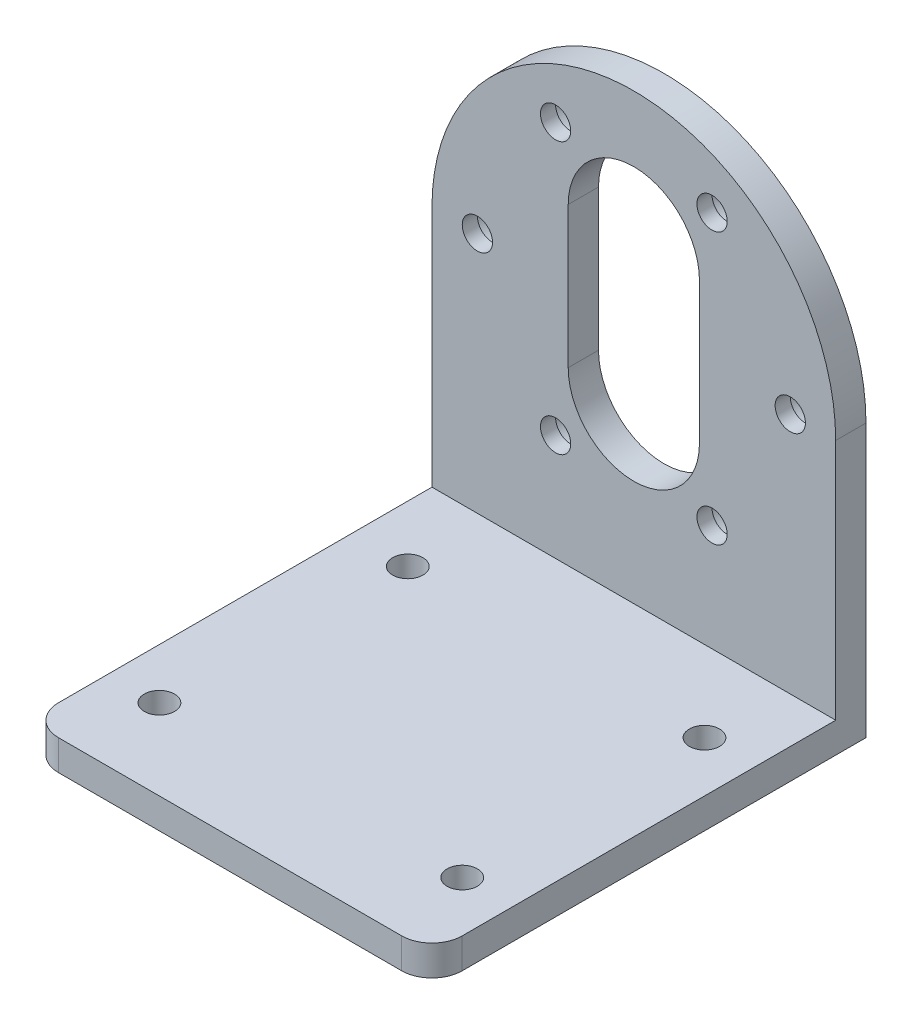
ISO-10303-21;
HEADER;
FILE_DESCRIPTION(('STEP AP214'),'2;1');
FILE_NAME('part.step','',(''),(''),'','','');
FILE_SCHEMA(('AUTOMOTIVE_DESIGN { 1 0 10303 214 1 1 1 1 }'));
ENDSEC;
DATA;
#1=APPLICATION_CONTEXT('core data for automotive mechanical design processes');
#2=APPLICATION_PROTOCOL_DEFINITION('international standard','automotive_design',2000,#1);
#3=PRODUCT_CONTEXT('',#1,'mechanical');
#4=PRODUCT('Part','Part','',(#3));
#5=PRODUCT_RELATED_PRODUCT_CATEGORY('part','',(#4));
#6=PRODUCT_DEFINITION_FORMATION('','',#4);
#7=PRODUCT_DEFINITION_CONTEXT('part definition',#1,'design');
#8=PRODUCT_DEFINITION('design','',#6,#7);
#9=PRODUCT_DEFINITION_SHAPE('','',#8);
#10=(LENGTH_UNIT() NAMED_UNIT(*) SI_UNIT(.MILLI.,.METRE.));
#11=(NAMED_UNIT(*) PLANE_ANGLE_UNIT() SI_UNIT($,.RADIAN.));
#12=(NAMED_UNIT(*) SI_UNIT($,.STERADIAN.) SOLID_ANGLE_UNIT());
#13=UNCERTAINTY_MEASURE_WITH_UNIT(LENGTH_MEASURE(1.E-05),#10,'distance_accuracy_value','');
#14=(GEOMETRIC_REPRESENTATION_CONTEXT(3) GLOBAL_UNCERTAINTY_ASSIGNED_CONTEXT((#13)) GLOBAL_UNIT_ASSIGNED_CONTEXT((#10,
#11,#12)) REPRESENTATION_CONTEXT('',''));
#15=CARTESIAN_POINT('',(0.,0.,0.));
#16=DIRECTION('',(0.,0.,1.));
#17=DIRECTION('',(1.,0.,0.));
#18=AXIS2_PLACEMENT_3D('',#15,#16,#17);
#19=CARTESIAN_POINT('',(-20.,27.,3.));
#20=DIRECTION('',(1.,0.,0.));
#21=DIRECTION('',(0.,0.,-1.));
#22=AXIS2_PLACEMENT_3D('',#19,#20,#21);
#23=PLANE('',#22);
#24=DIRECTION('',(0.,0.,-1.));
#25=VECTOR('',#24,1.);
#26=CARTESIAN_POINT('',(-20.,0.,3.));
#27=LINE('',#26,#25);
#28=CARTESIAN_POINT('',(-20.,0.,40.));
#29=VERTEX_POINT('',#28);
#30=CARTESIAN_POINT('',(-20.,0.,0.));
#31=VERTEX_POINT('',#30);
#32=EDGE_CURVE('E300',#29,#31,#27,.T.);
#33=ORIENTED_EDGE('',*,*,#32,.F.);
#34=DIRECTION('',(0.,-1.,0.));
#35=VECTOR('',#34,1.);
#36=CARTESIAN_POINT('',(-20.,27.,40.));
#37=LINE('',#36,#35);
#38=CARTESIAN_POINT('',(-20.,3.,40.));
#39=VERTEX_POINT('',#38);
#40=EDGE_CURVE('E11',#29,#39,#37,.F.);
#41=ORIENTED_EDGE('',*,*,#40,.T.);
#42=DIRECTION('',(0.,0.,-1.));
#43=VECTOR('',#42,1.);
#44=CARTESIAN_POINT('',(-20.,3.,43.));
#45=LINE('',#44,#43);
#46=CARTESIAN_POINT('',(-20.,3.,3.));
#47=VERTEX_POINT('',#46);
#48=EDGE_CURVE('E252',#39,#47,#45,.T.);
#49=ORIENTED_EDGE('',*,*,#48,.T.);
#50=DIRECTION('',(0.,-1.,0.));
#51=VECTOR('',#50,1.);
#52=CARTESIAN_POINT('',(-20.,27.,3.));
#53=LINE('',#52,#51);
#54=CARTESIAN_POINT('',(-20.,27.,3.));
#55=VERTEX_POINT('',#54);
#56=EDGE_CURVE('E406',#55,#47,#53,.T.);
#57=ORIENTED_EDGE('',*,*,#56,.F.);
#58=DIRECTION('',(0.,0.,-1.));
#59=VECTOR('',#58,1.);
#60=CARTESIAN_POINT('',(-20.,27.,3.));
#61=LINE('',#60,#59);
#62=CARTESIAN_POINT('',(-20.,27.,0.));
#63=VERTEX_POINT('',#62);
#64=EDGE_CURVE('E407',#55,#63,#61,.T.);
#65=ORIENTED_EDGE('',*,*,#64,.T.);
#66=DIRECTION('',(0.,-1.,0.));
#67=VECTOR('',#66,1.);
#68=CARTESIAN_POINT('',(-20.,27.,0.));
#69=LINE('',#68,#67);
#70=EDGE_CURVE('E274',#63,#31,#69,.T.);
#71=ORIENTED_EDGE('',*,*,#70,.T.);
#72=EDGE_LOOP('',(#33,#41,#49,#57,#65,#71));
#73=FACE_BOUND('',#72,.T.);
#74=ADVANCED_FACE('F35',(#73),#23,.F.);
#75=CARTESIAN_POINT('',(-20.,0.,3.));
#76=DIRECTION('',(0.,1.,0.));
#77=DIRECTION('',(0.,0.,1.));
#78=AXIS2_PLACEMENT_3D('',#75,#76,#77);
#79=PLANE('',#78);
#80=CARTESIAN_POINT('',(15.,0.,11.));
#81=DIRECTION('',(0.,-1.,0.));
#82=DIRECTION('',(0.,0.,-1.));
#83=AXIS2_PLACEMENT_3D('',#80,#81,#82);
#84=CIRCLE('',#83,1.5);
#85=CARTESIAN_POINT('',(15.,0.,9.5));
#86=VERTEX_POINT('',#85);
#87=EDGE_CURVE('E129',#86,#86,#84,.T.);
#88=ORIENTED_EDGE('',*,*,#87,.F.);
#89=EDGE_LOOP('',(#88));
#90=FACE_BOUND('',#89,.T.);
#91=CARTESIAN_POINT('',(-14.3941467899274,0.,11.));
#92=DIRECTION('',(0.,-1.,0.));
#93=DIRECTION('',(0.,0.,-1.));
#94=AXIS2_PLACEMENT_3D('',#91,#92,#93);
#95=CIRCLE('',#94,1.5);
#96=CARTESIAN_POINT('',(-14.3941467899274,0.,9.5));
#97=VERTEX_POINT('',#96);
#98=EDGE_CURVE('E161',#97,#97,#95,.T.);
#99=ORIENTED_EDGE('',*,*,#98,.F.);
#100=EDGE_LOOP('',(#99));
#101=FACE_BOUND('',#100,.T.);
#102=CARTESIAN_POINT('',(15.,0.,35.));
#103=DIRECTION('',(0.,-1.,0.));
#104=DIRECTION('',(0.,0.,-1.));
#105=AXIS2_PLACEMENT_3D('',#102,#103,#104);
#106=CIRCLE('',#105,1.5);
#107=CARTESIAN_POINT('',(15.,0.,33.5));
#108=VERTEX_POINT('',#107);
#109=EDGE_CURVE('E165',#108,#108,#106,.T.);
#110=ORIENTED_EDGE('',*,*,#109,.F.);
#111=EDGE_LOOP('',(#110));
#112=FACE_BOUND('',#111,.T.);
#113=CARTESIAN_POINT('',(-15.,0.,35.));
#114=DIRECTION('',(0.,-1.,0.));
#115=DIRECTION('',(0.,0.,-1.));
#116=AXIS2_PLACEMENT_3D('',#113,#114,#115);
#117=CIRCLE('',#116,1.5);
#118=CARTESIAN_POINT('',(-15.,0.,33.5));
#119=VERTEX_POINT('',#118);
#120=EDGE_CURVE('E169',#119,#119,#117,.T.);
#121=ORIENTED_EDGE('',*,*,#120,.F.);
#122=EDGE_LOOP('',(#121));
#123=FACE_BOUND('',#122,.T.);
#124=DIRECTION('',(0.,0.,-1.));
#125=VECTOR('',#124,1.);
#126=CARTESIAN_POINT('',(20.,0.,3.));
#127=LINE('',#126,#125);
#128=CARTESIAN_POINT('',(20.,0.,40.));
#129=VERTEX_POINT('',#128);
#130=CARTESIAN_POINT('',(20.,0.,0.));
#131=VERTEX_POINT('',#130);
#132=EDGE_CURVE('E288',#129,#131,#127,.T.);
#133=ORIENTED_EDGE('',*,*,#132,.F.);
#134=CARTESIAN_POINT('',(17.,0.,40.));
#135=DIRECTION('',(0.,1.,0.));
#136=DIRECTION('',(0.,0.,1.));
#137=AXIS2_PLACEMENT_3D('',#134,#135,#136);
#138=CIRCLE('',#137,3.);
#139=CARTESIAN_POINT('',(17.,0.,43.));
#140=VERTEX_POINT('',#139);
#141=EDGE_CURVE('E43',#129,#140,#138,.F.);
#142=ORIENTED_EDGE('',*,*,#141,.T.);
#143=DIRECTION('',(1.,0.,0.));
#144=VECTOR('',#143,1.);
#145=CARTESIAN_POINT('',(-20.,0.,43.));
#146=LINE('',#145,#144);
#147=CARTESIAN_POINT('',(-17.,0.,43.));
#148=VERTEX_POINT('',#147);
#149=EDGE_CURVE('E246',#148,#140,#146,.T.);
#150=ORIENTED_EDGE('',*,*,#149,.F.);
#151=CARTESIAN_POINT('',(-17.,0.,40.));
#152=DIRECTION('',(0.,1.,0.));
#153=DIRECTION('',(0.,0.,1.));
#154=AXIS2_PLACEMENT_3D('',#151,#152,#153);
#155=CIRCLE('',#154,3.);
#156=EDGE_CURVE('E281',#148,#29,#155,.F.);
#157=ORIENTED_EDGE('',*,*,#156,.T.);
#158=ORIENTED_EDGE('',*,*,#32,.T.);
#159=DIRECTION('',(1.,0.,0.));
#160=VECTOR('',#159,1.);
#161=CARTESIAN_POINT('',(-20.,0.,0.));
#162=LINE('',#161,#160);
#163=EDGE_CURVE('E396',#31,#131,#162,.T.);
#164=ORIENTED_EDGE('',*,*,#163,.T.);
#165=EDGE_LOOP('',(#133,#142,#150,#157,#158,#164));
#166=FACE_BOUND('',#165,.T.);
#167=ADVANCED_FACE('F286',(#90,#101,#112,#123,#166),#79,.F.);
#168=CARTESIAN_POINT('',(20.,27.,3.));
#169=DIRECTION('',(-1.,0.,0.));
#170=DIRECTION('',(0.,0.,1.));
#171=AXIS2_PLACEMENT_3D('',#168,#169,#170);
#172=PLANE('',#171);
#173=DIRECTION('',(0.,0.,-1.));
#174=VECTOR('',#173,1.);
#175=CARTESIAN_POINT('',(20.,3.,43.));
#176=LINE('',#175,#174);
#177=CARTESIAN_POINT('',(20.,3.,40.));
#178=VERTEX_POINT('',#177);
#179=CARTESIAN_POINT('',(20.,3.,3.));
#180=VERTEX_POINT('',#179);
#181=EDGE_CURVE('E270',#178,#180,#176,.T.);
#182=ORIENTED_EDGE('',*,*,#181,.F.);
#183=DIRECTION('',(0.,1.,0.));
#184=VECTOR('',#183,1.);
#185=CARTESIAN_POINT('',(20.,27.,40.));
#186=LINE('',#185,#184);
#187=EDGE_CURVE('E279',#178,#129,#186,.F.);
#188=ORIENTED_EDGE('',*,*,#187,.T.);
#189=ORIENTED_EDGE('',*,*,#132,.T.);
#190=DIRECTION('',(0.,1.,0.));
#191=VECTOR('',#190,1.);
#192=CARTESIAN_POINT('',(20.,27.,0.));
#193=LINE('',#192,#191);
#194=CARTESIAN_POINT('',(20.,27.,0.));
#195=VERTEX_POINT('',#194);
#196=EDGE_CURVE('E399',#131,#195,#193,.T.);
#197=ORIENTED_EDGE('',*,*,#196,.T.);
#198=DIRECTION('',(0.,0.,-1.));
#199=VECTOR('',#198,1.);
#200=CARTESIAN_POINT('',(20.,27.,3.));
#201=LINE('',#200,#199);
#202=CARTESIAN_POINT('',(20.,27.,3.));
#203=VERTEX_POINT('',#202);
#204=EDGE_CURVE('E409',#203,#195,#201,.T.);
#205=ORIENTED_EDGE('',*,*,#204,.F.);
#206=DIRECTION('',(0.,1.,0.));
#207=VECTOR('',#206,1.);
#208=CARTESIAN_POINT('',(20.,27.,3.));
#209=LINE('',#208,#207);
#210=EDGE_CURVE('E261',#180,#203,#209,.T.);
#211=ORIENTED_EDGE('',*,*,#210,.F.);
#212=EDGE_LOOP('',(#182,#188,#189,#197,#205,#211));
#213=FACE_BOUND('',#212,.T.);
#214=ADVANCED_FACE('F336',(#213),#172,.F.);
#215=CARTESIAN_POINT('',(0.,27.,3.));
#216=DIRECTION('',(0.,0.,-1.));
#217=DIRECTION('',(-1.,0.,0.));
#218=AXIS2_PLACEMENT_3D('',#215,#216,#217);
#219=CYLINDRICAL_SURFACE('',#218,20.);
#220=CARTESIAN_POINT('',(0.,27.,0.));
#221=DIRECTION('',(0.,0.,1.));
#222=DIRECTION('',(1.,0.,0.));
#223=AXIS2_PLACEMENT_3D('',#220,#221,#222);
#224=CIRCLE('',#223,20.);
#225=EDGE_CURVE('E395',#195,#63,#224,.T.);
#226=ORIENTED_EDGE('',*,*,#225,.T.);
#227=ORIENTED_EDGE('',*,*,#64,.F.);
#228=CARTESIAN_POINT('',(0.,27.,3.));
#229=DIRECTION('',(0.,0.,1.));
#230=DIRECTION('',(1.,0.,0.));
#231=AXIS2_PLACEMENT_3D('',#228,#229,#230);
#232=CIRCLE('',#231,20.);
#233=EDGE_CURVE('E402',#203,#55,#232,.T.);
#234=ORIENTED_EDGE('',*,*,#233,.F.);
#235=ORIENTED_EDGE('',*,*,#204,.T.);
#236=EDGE_LOOP('',(#226,#227,#234,#235));
#237=FACE_BOUND('',#236,.T.);
#238=ADVANCED_FACE('F421',(#237),#219,.T.);
#239=CARTESIAN_POINT('',(0.,27.,3.));
#240=DIRECTION('',(0.,0.,1.));
#241=DIRECTION('',(1.,0.,0.));
#242=AXIS2_PLACEMENT_3D('',#239,#240,#241);
#243=PLANE('',#242);
#244=CARTESIAN_POINT('',(0.,34.,3.));
#245=DIRECTION('',(0.,0.,1.));
#246=DIRECTION('',(1.,0.,0.));
#247=AXIS2_PLACEMENT_3D('',#244,#245,#246);
#248=CIRCLE('',#247,6.5);
#249=CARTESIAN_POINT('',(-6.5,34.,3.));
#250=VERTEX_POINT('',#249);
#251=CARTESIAN_POINT('',(6.5,34.,3.));
#252=VERTEX_POINT('',#251);
#253=EDGE_CURVE('E133',#250,#252,#248,.F.);
#254=ORIENTED_EDGE('',*,*,#253,.T.);
#255=DIRECTION('',(0.,-1.,0.));
#256=VECTOR('',#255,1.);
#257=CARTESIAN_POINT('',(6.5,34.,3.));
#258=LINE('',#257,#256);
#259=CARTESIAN_POINT('',(6.5,20.,3.));
#260=VERTEX_POINT('',#259);
#261=EDGE_CURVE('E122',#252,#260,#258,.T.);
#262=ORIENTED_EDGE('',*,*,#261,.T.);
#263=CARTESIAN_POINT('',(0.,20.,3.));
#264=DIRECTION('',(0.,0.,1.));
#265=DIRECTION('',(1.,0.,0.));
#266=AXIS2_PLACEMENT_3D('',#263,#264,#265);
#267=CIRCLE('',#266,6.5);
#268=CARTESIAN_POINT('',(-6.5,20.,3.));
#269=VERTEX_POINT('',#268);
#270=EDGE_CURVE('E144',#260,#269,#267,.F.);
#271=ORIENTED_EDGE('',*,*,#270,.T.);
#272=DIRECTION('',(0.,1.,0.));
#273=VECTOR('',#272,1.);
#274=CARTESIAN_POINT('',(-6.5,34.,3.));
#275=LINE('',#274,#273);
#276=EDGE_CURVE('E140',#269,#250,#275,.T.);
#277=ORIENTED_EDGE('',*,*,#276,.T.);
#278=EDGE_LOOP('',(#254,#262,#271,#277));
#279=FACE_BOUND('',#278,.T.);
#280=CARTESIAN_POINT('',(7.74999999999997,13.5766062413414,3.));
#281=DIRECTION('',(0.,0.,1.));
#282=DIRECTION('',(1.,0.,0.));
#283=AXIS2_PLACEMENT_3D('',#280,#281,#282);
#284=CIRCLE('',#283,1.5);
#285=CARTESIAN_POINT('',(9.24999999999997,13.5766062413414,3.));
#286=VERTEX_POINT('',#285);
#287=EDGE_CURVE('E176',#286,#286,#284,.T.);
#288=ORIENTED_EDGE('',*,*,#287,.F.);
#289=EDGE_LOOP('',(#288));
#290=FACE_BOUND('',#289,.T.);
#291=CARTESIAN_POINT('',(-7.75000000000006,13.5766062413415,3.));
#292=DIRECTION('',(0.,0.,1.));
#293=DIRECTION('',(1.,0.,0.));
#294=AXIS2_PLACEMENT_3D('',#291,#292,#293);
#295=CIRCLE('',#294,1.5);
#296=CARTESIAN_POINT('',(-6.25000000000006,13.5766062413415,3.));
#297=VERTEX_POINT('',#296);
#298=EDGE_CURVE('E182',#297,#297,#295,.T.);
#299=ORIENTED_EDGE('',*,*,#298,.F.);
#300=EDGE_LOOP('',(#299));
#301=FACE_BOUND('',#300,.T.);
#302=CARTESIAN_POINT('',(-15.5,27.0000000000003,3.));
#303=DIRECTION('',(0.,0.,1.));
#304=DIRECTION('',(1.,0.,0.));
#305=AXIS2_PLACEMENT_3D('',#302,#303,#304);
#306=CIRCLE('',#305,1.5);
#307=CARTESIAN_POINT('',(-14.,27.0000000000003,3.));
#308=VERTEX_POINT('',#307);
#309=EDGE_CURVE('E188',#308,#308,#306,.T.);
#310=ORIENTED_EDGE('',*,*,#309,.F.);
#311=EDGE_LOOP('',(#310));
#312=FACE_BOUND('',#311,.T.);
#313=CARTESIAN_POINT('',(-7.74999999999988,40.4233937586591,3.));
#314=DIRECTION('',(0.,0.,1.));
#315=DIRECTION('',(1.,0.,0.));
#316=AXIS2_PLACEMENT_3D('',#313,#314,#315);
#317=CIRCLE('',#316,1.5);
#318=CARTESIAN_POINT('',(-6.24999999999988,40.4233937586591,3.));
#319=VERTEX_POINT('',#318);
#320=EDGE_CURVE('E194',#319,#319,#317,.T.);
#321=ORIENTED_EDGE('',*,*,#320,.F.);
#322=EDGE_LOOP('',(#321));
#323=FACE_BOUND('',#322,.T.);
#324=CARTESIAN_POINT('',(7.75000000000015,40.4233937586589,3.));
#325=DIRECTION('',(0.,0.,1.));
#326=DIRECTION('',(1.,0.,0.));
#327=AXIS2_PLACEMENT_3D('',#324,#325,#326);
#328=CIRCLE('',#327,1.5);
#329=CARTESIAN_POINT('',(9.25000000000015,40.4233937586589,3.));
#330=VERTEX_POINT('',#329);
#331=EDGE_CURVE('E200',#330,#330,#328,.T.);
#332=ORIENTED_EDGE('',*,*,#331,.F.);
#333=EDGE_LOOP('',(#332));
#334=FACE_BOUND('',#333,.T.);
#335=CARTESIAN_POINT('',(15.5,27.,3.));
#336=DIRECTION('',(0.,0.,1.));
#337=DIRECTION('',(1.,0.,0.));
#338=AXIS2_PLACEMENT_3D('',#335,#336,#337);
#339=CIRCLE('',#338,1.5);
#340=CARTESIAN_POINT('',(17.,27.,3.));
#341=VERTEX_POINT('',#340);
#342=EDGE_CURVE('E206',#341,#341,#339,.T.);
#343=ORIENTED_EDGE('',*,*,#342,.F.);
#344=EDGE_LOOP('',(#343));
#345=FACE_BOUND('',#344,.T.);
#346=DIRECTION('',(-1.,0.,0.));
#347=VECTOR('',#346,1.);
#348=CARTESIAN_POINT('',(-20.,3.,3.));
#349=LINE('',#348,#347);
#350=EDGE_CURVE('E243',#180,#47,#349,.T.);
#351=ORIENTED_EDGE('',*,*,#350,.F.);
#352=ORIENTED_EDGE('',*,*,#210,.T.);
#353=ORIENTED_EDGE('',*,*,#233,.T.);
#354=ORIENTED_EDGE('',*,*,#56,.T.);
#355=EDGE_LOOP('',(#351,#352,#353,#354));
#356=FACE_BOUND('',#355,.T.);
#357=ADVANCED_FACE('F138',(#279,#290,#301,#312,#323,#334,#345,#356),#243,.T.);
#358=CARTESIAN_POINT('',(0.,27.,0.));
#359=DIRECTION('',(0.,0.,1.));
#360=DIRECTION('',(1.,0.,0.));
#361=AXIS2_PLACEMENT_3D('',#358,#359,#360);
#362=PLANE('',#361);
#363=DIRECTION('',(0.,-1.,0.));
#364=VECTOR('',#363,1.);
#365=CARTESIAN_POINT('',(6.5,34.,0.));
#366=LINE('',#365,#364);
#367=CARTESIAN_POINT('',(6.5,34.,0.));
#368=VERTEX_POINT('',#367);
#369=CARTESIAN_POINT('',(6.5,20.,0.));
#370=VERTEX_POINT('',#369);
#371=EDGE_CURVE('E142',#368,#370,#366,.T.);
#372=ORIENTED_EDGE('',*,*,#371,.F.);
#373=CARTESIAN_POINT('',(0.,34.,0.));
#374=DIRECTION('',(0.,0.,-1.));
#375=DIRECTION('',(-1.,0.,0.));
#376=AXIS2_PLACEMENT_3D('',#373,#374,#375);
#377=CIRCLE('',#376,6.5);
#378=CARTESIAN_POINT('',(-6.5,34.,0.));
#379=VERTEX_POINT('',#378);
#380=EDGE_CURVE('E58',#379,#368,#377,.T.);
#381=ORIENTED_EDGE('',*,*,#380,.F.);
#382=DIRECTION('',(0.,1.,0.));
#383=VECTOR('',#382,1.);
#384=CARTESIAN_POINT('',(-6.5,34.,0.));
#385=LINE('',#384,#383);
#386=CARTESIAN_POINT('',(-6.5,20.,0.));
#387=VERTEX_POINT('',#386);
#388=EDGE_CURVE('E135',#387,#379,#385,.T.);
#389=ORIENTED_EDGE('',*,*,#388,.F.);
#390=CARTESIAN_POINT('',(0.,20.,0.));
#391=DIRECTION('',(0.,0.,-1.));
#392=DIRECTION('',(-1.,0.,0.));
#393=AXIS2_PLACEMENT_3D('',#390,#391,#392);
#394=CIRCLE('',#393,6.5);
#395=EDGE_CURVE('E149',#370,#387,#394,.T.);
#396=ORIENTED_EDGE('',*,*,#395,.F.);
#397=EDGE_LOOP('',(#372,#381,#389,#396));
#398=FACE_BOUND('',#397,.T.);
#399=CARTESIAN_POINT('',(7.74999999999997,13.5766062413414,0.));
#400=DIRECTION('',(0.,0.,-1.));
#401=DIRECTION('',(-1.,0.,0.));
#402=AXIS2_PLACEMENT_3D('',#399,#400,#401);
#403=CIRCLE('',#402,2.5);
#404=CARTESIAN_POINT('',(5.24999999999997,13.5766062413414,0.));
#405=VERTEX_POINT('',#404);
#406=EDGE_CURVE('E209',#405,#405,#403,.T.);
#407=ORIENTED_EDGE('',*,*,#406,.F.);
#408=EDGE_LOOP('',(#407));
#409=FACE_BOUND('',#408,.T.);
#410=CARTESIAN_POINT('',(-7.75000000000006,13.5766062413415,0.));
#411=DIRECTION('',(0.,0.,-1.));
#412=DIRECTION('',(-1.,0.,0.));
#413=AXIS2_PLACEMENT_3D('',#410,#411,#412);
#414=CIRCLE('',#413,2.5);
#415=CARTESIAN_POINT('',(-10.2500000000001,13.5766062413415,0.));
#416=VERTEX_POINT('',#415);
#417=EDGE_CURVE('E213',#416,#416,#414,.T.);
#418=ORIENTED_EDGE('',*,*,#417,.F.);
#419=EDGE_LOOP('',(#418));
#420=FACE_BOUND('',#419,.T.);
#421=CARTESIAN_POINT('',(-15.5,27.0000000000003,0.));
#422=DIRECTION('',(0.,0.,-1.));
#423=DIRECTION('',(-1.,0.,0.));
#424=AXIS2_PLACEMENT_3D('',#421,#422,#423);
#425=CIRCLE('',#424,2.5);
#426=CARTESIAN_POINT('',(-18.,27.0000000000003,0.));
#427=VERTEX_POINT('',#426);
#428=EDGE_CURVE('E219',#427,#427,#425,.T.);
#429=ORIENTED_EDGE('',*,*,#428,.F.);
#430=EDGE_LOOP('',(#429));
#431=FACE_BOUND('',#430,.T.);
#432=CARTESIAN_POINT('',(-7.74999999999988,40.4233937586591,0.));
#433=DIRECTION('',(0.,0.,-1.));
#434=DIRECTION('',(-1.,0.,0.));
#435=AXIS2_PLACEMENT_3D('',#432,#433,#434);
#436=CIRCLE('',#435,2.49999999999999);
#437=CARTESIAN_POINT('',(-10.2499999999999,40.4233937586591,0.));
#438=VERTEX_POINT('',#437);
#439=EDGE_CURVE('E225',#438,#438,#436,.T.);
#440=ORIENTED_EDGE('',*,*,#439,.F.);
#441=EDGE_LOOP('',(#440));
#442=FACE_BOUND('',#441,.T.);
#443=CARTESIAN_POINT('',(7.75000000000015,40.4233937586589,0.));
#444=DIRECTION('',(0.,0.,-1.));
#445=DIRECTION('',(-1.,0.,0.));
#446=AXIS2_PLACEMENT_3D('',#443,#444,#445);
#447=CIRCLE('',#446,2.5);
#448=CARTESIAN_POINT('',(5.25000000000015,40.4233937586589,0.));
#449=VERTEX_POINT('',#448);
#450=EDGE_CURVE('E231',#449,#449,#447,.T.);
#451=ORIENTED_EDGE('',*,*,#450,.F.);
#452=EDGE_LOOP('',(#451));
#453=FACE_BOUND('',#452,.T.);
#454=CARTESIAN_POINT('',(15.5,27.,0.));
#455=DIRECTION('',(0.,0.,-1.));
#456=DIRECTION('',(-1.,0.,0.));
#457=AXIS2_PLACEMENT_3D('',#454,#455,#456);
#458=CIRCLE('',#457,2.5);
#459=CARTESIAN_POINT('',(13.,27.,0.));
#460=VERTEX_POINT('',#459);
#461=EDGE_CURVE('E237',#460,#460,#458,.T.);
#462=ORIENTED_EDGE('',*,*,#461,.F.);
#463=EDGE_LOOP('',(#462));
#464=FACE_BOUND('',#463,.T.);
#465=ORIENTED_EDGE('',*,*,#70,.F.);
#466=ORIENTED_EDGE('',*,*,#225,.F.);
#467=ORIENTED_EDGE('',*,*,#196,.F.);
#468=ORIENTED_EDGE('',*,*,#163,.F.);
#469=EDGE_LOOP('',(#465,#466,#467,#468));
#470=FACE_BOUND('',#469,.T.);
#471=ADVANCED_FACE('F374',(#398,#409,#420,#431,#442,#453,#464,#470),#362,.F.);
#472=CARTESIAN_POINT('',(-20.,3.,43.));
#473=DIRECTION('',(0.,-1.,0.));
#474=DIRECTION('',(0.,0.,-1.));
#475=AXIS2_PLACEMENT_3D('',#472,#473,#474);
#476=PLANE('',#475);
#477=CARTESIAN_POINT('',(15.,3.,11.));
#478=DIRECTION('',(0.,-1.,0.));
#479=DIRECTION('',(0.,0.,-1.));
#480=AXIS2_PLACEMENT_3D('',#477,#478,#479);
#481=CIRCLE('',#480,1.5);
#482=CARTESIAN_POINT('',(15.,3.,9.5));
#483=VERTEX_POINT('',#482);
#484=EDGE_CURVE('E160',#483,#483,#481,.T.);
#485=ORIENTED_EDGE('',*,*,#484,.T.);
#486=EDGE_LOOP('',(#485));
#487=FACE_BOUND('',#486,.T.);
#488=CARTESIAN_POINT('',(-14.3941467899274,3.,11.));
#489=DIRECTION('',(0.,-1.,0.));
#490=DIRECTION('',(0.,0.,-1.));
#491=AXIS2_PLACEMENT_3D('',#488,#489,#490);
#492=CIRCLE('',#491,1.5);
#493=CARTESIAN_POINT('',(-14.3941467899274,3.,9.5));
#494=VERTEX_POINT('',#493);
#495=EDGE_CURVE('E164',#494,#494,#492,.T.);
#496=ORIENTED_EDGE('',*,*,#495,.T.);
#497=EDGE_LOOP('',(#496));
#498=FACE_BOUND('',#497,.T.);
#499=CARTESIAN_POINT('',(15.,3.,35.));
#500=DIRECTION('',(0.,-1.,0.));
#501=DIRECTION('',(0.,0.,-1.));
#502=AXIS2_PLACEMENT_3D('',#499,#500,#501);
#503=CIRCLE('',#502,1.5);
#504=CARTESIAN_POINT('',(15.,3.,33.5));
#505=VERTEX_POINT('',#504);
#506=EDGE_CURVE('E168',#505,#505,#503,.T.);
#507=ORIENTED_EDGE('',*,*,#506,.T.);
#508=EDGE_LOOP('',(#507));
#509=FACE_BOUND('',#508,.T.);
#510=CARTESIAN_POINT('',(-15.,3.,35.));
#511=DIRECTION('',(0.,-1.,0.));
#512=DIRECTION('',(0.,0.,-1.));
#513=AXIS2_PLACEMENT_3D('',#510,#511,#512);
#514=CIRCLE('',#513,1.5);
#515=CARTESIAN_POINT('',(-15.,3.,33.5));
#516=VERTEX_POINT('',#515);
#517=EDGE_CURVE('E172',#516,#516,#514,.T.);
#518=ORIENTED_EDGE('',*,*,#517,.T.);
#519=EDGE_LOOP('',(#518));
#520=FACE_BOUND('',#519,.T.);
#521=DIRECTION('',(-1.,0.,0.));
#522=VECTOR('',#521,1.);
#523=CARTESIAN_POINT('',(-20.,3.,43.));
#524=LINE('',#523,#522);
#525=CARTESIAN_POINT('',(17.,3.,43.));
#526=VERTEX_POINT('',#525);
#527=CARTESIAN_POINT('',(-17.,3.,43.));
#528=VERTEX_POINT('',#527);
#529=EDGE_CURVE('E249',#526,#528,#524,.T.);
#530=ORIENTED_EDGE('',*,*,#529,.F.);
#531=CARTESIAN_POINT('',(17.,3.,40.));
#532=DIRECTION('',(0.,-1.,0.));
#533=DIRECTION('',(0.,0.,-1.));
#534=AXIS2_PLACEMENT_3D('',#531,#532,#533);
#535=CIRCLE('',#534,3.);
#536=EDGE_CURVE('E277',#526,#178,#535,.F.);
#537=ORIENTED_EDGE('',*,*,#536,.T.);
#538=ORIENTED_EDGE('',*,*,#181,.T.);
#539=ORIENTED_EDGE('',*,*,#350,.T.);
#540=ORIENTED_EDGE('',*,*,#48,.F.);
#541=CARTESIAN_POINT('',(-17.,3.,40.));
#542=DIRECTION('',(0.,-1.,0.));
#543=DIRECTION('',(0.,0.,-1.));
#544=AXIS2_PLACEMENT_3D('',#541,#542,#543);
#545=CIRCLE('',#544,3.);
#546=EDGE_CURVE('E275',#39,#528,#545,.F.);
#547=ORIENTED_EDGE('',*,*,#546,.T.);
#548=EDGE_LOOP('',(#530,#537,#538,#539,#540,#547));
#549=FACE_BOUND('',#548,.T.);
#550=ADVANCED_FACE('F311',(#487,#498,#509,#520,#549),#476,.F.);
#551=CARTESIAN_POINT('',(0.,0.,43.));
#552=DIRECTION('',(0.,0.,-1.));
#553=DIRECTION('',(-1.,0.,0.));
#554=AXIS2_PLACEMENT_3D('',#551,#552,#553);
#555=PLANE('',#554);
#556=ORIENTED_EDGE('',*,*,#149,.T.);
#557=DIRECTION('',(0.,1.,0.));
#558=VECTOR('',#557,1.);
#559=CARTESIAN_POINT('',(17.,0.,43.));
#560=LINE('',#559,#558);
#561=EDGE_CURVE('E271',#140,#526,#560,.T.);
#562=ORIENTED_EDGE('',*,*,#561,.T.);
#563=ORIENTED_EDGE('',*,*,#529,.T.);
#564=DIRECTION('',(0.,-1.,0.));
#565=VECTOR('',#564,1.);
#566=CARTESIAN_POINT('',(-17.,0.,43.));
#567=LINE('',#566,#565);
#568=EDGE_CURVE('E298',#528,#148,#567,.T.);
#569=ORIENTED_EDGE('',*,*,#568,.T.);
#570=EDGE_LOOP('',(#556,#562,#563,#569));
#571=FACE_BOUND('',#570,.T.);
#572=ADVANCED_FACE('F295',(#571),#555,.F.);
#573=CARTESIAN_POINT('',(15.5,27.,1.5));
#574=DIRECTION('',(0.,0.,-1.));
#575=DIRECTION('',(-1.,0.,0.));
#576=AXIS2_PLACEMENT_3D('',#573,#574,#575);
#577=CYLINDRICAL_SURFACE('',#576,2.5);
#578=CARTESIAN_POINT('',(15.5,27.,1.5));
#579=DIRECTION('',(0.,0.,-1.));
#580=DIRECTION('',(-1.,0.,0.));
#581=AXIS2_PLACEMENT_3D('',#578,#579,#580);
#582=CIRCLE('',#581,2.5);
#583=CARTESIAN_POINT('',(13.,27.,1.5));
#584=VERTEX_POINT('',#583);
#585=EDGE_CURVE('E240',#584,#584,#582,.T.);
#586=ORIENTED_EDGE('',*,*,#585,.F.);
#587=EDGE_LOOP('',(#586));
#588=FACE_BOUND('',#587,.T.);
#589=ORIENTED_EDGE('',*,*,#461,.T.);
#590=EDGE_LOOP('',(#589));
#591=FACE_BOUND('',#590,.T.);
#592=ADVANCED_FACE('F440',(#588,#591),#577,.F.);
#593=CARTESIAN_POINT('',(15.5,27.,1.5));
#594=DIRECTION('',(0.,0.,-1.));
#595=DIRECTION('',(-1.,0.,0.));
#596=AXIS2_PLACEMENT_3D('',#593,#594,#595);
#597=PLANE('',#596);
#598=CARTESIAN_POINT('',(15.5,27.,1.5));
#599=DIRECTION('',(0.,0.,-1.));
#600=DIRECTION('',(-1.,0.,0.));
#601=AXIS2_PLACEMENT_3D('',#598,#599,#600);
#602=CIRCLE('',#601,1.5);
#603=CARTESIAN_POINT('',(14.,27.,1.5));
#604=VERTEX_POINT('',#603);
#605=EDGE_CURVE('E203',#604,#604,#602,.T.);
#606=ORIENTED_EDGE('',*,*,#605,.F.);
#607=EDGE_LOOP('',(#606));
#608=FACE_BOUND('',#607,.T.);
#609=ORIENTED_EDGE('',*,*,#585,.T.);
#610=EDGE_LOOP('',(#609));
#611=FACE_BOUND('',#610,.T.);
#612=ADVANCED_FACE('F443',(#608,#611),#597,.T.);
#613=CARTESIAN_POINT('',(7.75000000000015,40.4233937586589,1.5));
#614=DIRECTION('',(0.,0.,-1.));
#615=DIRECTION('',(-1.,0.,0.));
#616=AXIS2_PLACEMENT_3D('',#613,#614,#615);
#617=CYLINDRICAL_SURFACE('',#616,2.5);
#618=CARTESIAN_POINT('',(7.75000000000015,40.4233937586589,1.5));
#619=DIRECTION('',(0.,0.,-1.));
#620=DIRECTION('',(-1.,0.,0.));
#621=AXIS2_PLACEMENT_3D('',#618,#619,#620);
#622=CIRCLE('',#621,2.5);
#623=CARTESIAN_POINT('',(5.25000000000015,40.4233937586589,1.5));
#624=VERTEX_POINT('',#623);
#625=EDGE_CURVE('E234',#624,#624,#622,.T.);
#626=ORIENTED_EDGE('',*,*,#625,.F.);
#627=EDGE_LOOP('',(#626));
#628=FACE_BOUND('',#627,.T.);
#629=ORIENTED_EDGE('',*,*,#450,.T.);
#630=EDGE_LOOP('',(#629));
#631=FACE_BOUND('',#630,.T.);
#632=ADVANCED_FACE('F447',(#628,#631),#617,.F.);
#633=CARTESIAN_POINT('',(7.75000000000015,40.4233937586589,1.5));
#634=DIRECTION('',(0.,0.,-1.));
#635=DIRECTION('',(-1.,0.,0.));
#636=AXIS2_PLACEMENT_3D('',#633,#634,#635);
#637=PLANE('',#636);
#638=CARTESIAN_POINT('',(7.75000000000015,40.4233937586589,1.5));
#639=DIRECTION('',(0.,0.,-1.));
#640=DIRECTION('',(-1.,0.,0.));
#641=AXIS2_PLACEMENT_3D('',#638,#639,#640);
#642=CIRCLE('',#641,1.5);
#643=CARTESIAN_POINT('',(6.25000000000015,40.4233937586589,1.5));
#644=VERTEX_POINT('',#643);
#645=EDGE_CURVE('E197',#644,#644,#642,.T.);
#646=ORIENTED_EDGE('',*,*,#645,.F.);
#647=EDGE_LOOP('',(#646));
#648=FACE_BOUND('',#647,.T.);
#649=ORIENTED_EDGE('',*,*,#625,.T.);
#650=EDGE_LOOP('',(#649));
#651=FACE_BOUND('',#650,.T.);
#652=ADVANCED_FACE('F451',(#648,#651),#637,.T.);
#653=CARTESIAN_POINT('',(-7.74999999999988,40.4233937586591,1.5));
#654=DIRECTION('',(0.,0.,-1.));
#655=DIRECTION('',(-1.,0.,0.));
#656=AXIS2_PLACEMENT_3D('',#653,#654,#655);
#657=CYLINDRICAL_SURFACE('',#656,2.49999999999999);
#658=CARTESIAN_POINT('',(-7.74999999999988,40.4233937586591,1.5));
#659=DIRECTION('',(0.,0.,-1.));
#660=DIRECTION('',(-1.,0.,0.));
#661=AXIS2_PLACEMENT_3D('',#658,#659,#660);
#662=CIRCLE('',#661,2.49999999999999);
#663=CARTESIAN_POINT('',(-10.2499999999999,40.4233937586591,1.5));
#664=VERTEX_POINT('',#663);
#665=EDGE_CURVE('E228',#664,#664,#662,.T.);
#666=ORIENTED_EDGE('',*,*,#665,.F.);
#667=EDGE_LOOP('',(#666));
#668=FACE_BOUND('',#667,.T.);
#669=ORIENTED_EDGE('',*,*,#439,.T.);
#670=EDGE_LOOP('',(#669));
#671=FACE_BOUND('',#670,.T.);
#672=ADVANCED_FACE('F455',(#668,#671),#657,.F.);
#673=CARTESIAN_POINT('',(-7.74999999999988,40.4233937586591,1.5));
#674=DIRECTION('',(0.,0.,-1.));
#675=DIRECTION('',(-1.,0.,0.));
#676=AXIS2_PLACEMENT_3D('',#673,#674,#675);
#677=PLANE('',#676);
#678=CARTESIAN_POINT('',(-7.74999999999988,40.4233937586591,1.5));
#679=DIRECTION('',(0.,0.,-1.));
#680=DIRECTION('',(-1.,0.,0.));
#681=AXIS2_PLACEMENT_3D('',#678,#679,#680);
#682=CIRCLE('',#681,1.5);
#683=CARTESIAN_POINT('',(-9.24999999999988,40.4233937586591,1.5));
#684=VERTEX_POINT('',#683);
#685=EDGE_CURVE('E191',#684,#684,#682,.T.);
#686=ORIENTED_EDGE('',*,*,#685,.F.);
#687=EDGE_LOOP('',(#686));
#688=FACE_BOUND('',#687,.T.);
#689=ORIENTED_EDGE('',*,*,#665,.T.);
#690=EDGE_LOOP('',(#689));
#691=FACE_BOUND('',#690,.T.);
#692=ADVANCED_FACE('F459',(#688,#691),#677,.T.);
#693=CARTESIAN_POINT('',(-15.5,27.0000000000003,1.5));
#694=DIRECTION('',(0.,0.,-1.));
#695=DIRECTION('',(-1.,0.,0.));
#696=AXIS2_PLACEMENT_3D('',#693,#694,#695);
#697=CYLINDRICAL_SURFACE('',#696,2.5);
#698=CARTESIAN_POINT('',(-15.5,27.0000000000003,1.5));
#699=DIRECTION('',(0.,0.,-1.));
#700=DIRECTION('',(-1.,0.,0.));
#701=AXIS2_PLACEMENT_3D('',#698,#699,#700);
#702=CIRCLE('',#701,2.5);
#703=CARTESIAN_POINT('',(-18.,27.0000000000003,1.5));
#704=VERTEX_POINT('',#703);
#705=EDGE_CURVE('E222',#704,#704,#702,.T.);
#706=ORIENTED_EDGE('',*,*,#705,.F.);
#707=EDGE_LOOP('',(#706));
#708=FACE_BOUND('',#707,.T.);
#709=ORIENTED_EDGE('',*,*,#428,.T.);
#710=EDGE_LOOP('',(#709));
#711=FACE_BOUND('',#710,.T.);
#712=ADVANCED_FACE('F463',(#708,#711),#697,.F.);
#713=CARTESIAN_POINT('',(-15.5,27.0000000000003,1.5));
#714=DIRECTION('',(0.,0.,-1.));
#715=DIRECTION('',(-1.,0.,0.));
#716=AXIS2_PLACEMENT_3D('',#713,#714,#715);
#717=PLANE('',#716);
#718=CARTESIAN_POINT('',(-15.5,27.0000000000003,1.5));
#719=DIRECTION('',(0.,0.,-1.));
#720=DIRECTION('',(-1.,0.,0.));
#721=AXIS2_PLACEMENT_3D('',#718,#719,#720);
#722=CIRCLE('',#721,1.5);
#723=CARTESIAN_POINT('',(-17.,27.0000000000003,1.5));
#724=VERTEX_POINT('',#723);
#725=EDGE_CURVE('E185',#724,#724,#722,.T.);
#726=ORIENTED_EDGE('',*,*,#725,.F.);
#727=EDGE_LOOP('',(#726));
#728=FACE_BOUND('',#727,.T.);
#729=ORIENTED_EDGE('',*,*,#705,.T.);
#730=EDGE_LOOP('',(#729));
#731=FACE_BOUND('',#730,.T.);
#732=ADVANCED_FACE('F467',(#728,#731),#717,.T.);
#733=CARTESIAN_POINT('',(-7.75000000000006,13.5766062413415,1.5));
#734=DIRECTION('',(0.,0.,-1.));
#735=DIRECTION('',(-1.,0.,0.));
#736=AXIS2_PLACEMENT_3D('',#733,#734,#735);
#737=CYLINDRICAL_SURFACE('',#736,2.5);
#738=CARTESIAN_POINT('',(-7.75000000000006,13.5766062413415,1.5));
#739=DIRECTION('',(0.,0.,-1.));
#740=DIRECTION('',(-1.,0.,0.));
#741=AXIS2_PLACEMENT_3D('',#738,#739,#740);
#742=CIRCLE('',#741,2.5);
#743=CARTESIAN_POINT('',(-10.2500000000001,13.5766062413415,1.5));
#744=VERTEX_POINT('',#743);
#745=EDGE_CURVE('E216',#744,#744,#742,.T.);
#746=ORIENTED_EDGE('',*,*,#745,.F.);
#747=EDGE_LOOP('',(#746));
#748=FACE_BOUND('',#747,.T.);
#749=ORIENTED_EDGE('',*,*,#417,.T.);
#750=EDGE_LOOP('',(#749));
#751=FACE_BOUND('',#750,.T.);
#752=ADVANCED_FACE('F471',(#748,#751),#737,.F.);
#753=CARTESIAN_POINT('',(-7.75000000000006,13.5766062413415,1.5));
#754=DIRECTION('',(0.,0.,-1.));
#755=DIRECTION('',(-1.,0.,0.));
#756=AXIS2_PLACEMENT_3D('',#753,#754,#755);
#757=PLANE('',#756);
#758=CARTESIAN_POINT('',(-7.75000000000006,13.5766062413415,1.5));
#759=DIRECTION('',(0.,0.,-1.));
#760=DIRECTION('',(-1.,0.,0.));
#761=AXIS2_PLACEMENT_3D('',#758,#759,#760);
#762=CIRCLE('',#761,1.5);
#763=CARTESIAN_POINT('',(-9.25000000000006,13.5766062413415,1.5));
#764=VERTEX_POINT('',#763);
#765=EDGE_CURVE('E179',#764,#764,#762,.T.);
#766=ORIENTED_EDGE('',*,*,#765,.F.);
#767=EDGE_LOOP('',(#766));
#768=FACE_BOUND('',#767,.T.);
#769=ORIENTED_EDGE('',*,*,#745,.T.);
#770=EDGE_LOOP('',(#769));
#771=FACE_BOUND('',#770,.T.);
#772=ADVANCED_FACE('F475',(#768,#771),#757,.T.);
#773=CARTESIAN_POINT('',(7.74999999999997,13.5766062413414,1.5));
#774=DIRECTION('',(0.,0.,-1.));
#775=DIRECTION('',(-1.,0.,0.));
#776=AXIS2_PLACEMENT_3D('',#773,#774,#775);
#777=CYLINDRICAL_SURFACE('',#776,2.5);
#778=CARTESIAN_POINT('',(7.74999999999997,13.5766062413414,1.5));
#779=DIRECTION('',(0.,0.,-1.));
#780=DIRECTION('',(-1.,0.,0.));
#781=AXIS2_PLACEMENT_3D('',#778,#779,#780);
#782=CIRCLE('',#781,2.5);
#783=CARTESIAN_POINT('',(5.24999999999997,13.5766062413414,1.5));
#784=VERTEX_POINT('',#783);
#785=EDGE_CURVE('E210',#784,#784,#782,.T.);
#786=ORIENTED_EDGE('',*,*,#785,.F.);
#787=EDGE_LOOP('',(#786));
#788=FACE_BOUND('',#787,.T.);
#789=ORIENTED_EDGE('',*,*,#406,.T.);
#790=EDGE_LOOP('',(#789));
#791=FACE_BOUND('',#790,.T.);
#792=ADVANCED_FACE('F479',(#788,#791),#777,.F.);
#793=CARTESIAN_POINT('',(7.74999999999997,13.5766062413414,1.5));
#794=DIRECTION('',(0.,0.,-1.));
#795=DIRECTION('',(-1.,0.,0.));
#796=AXIS2_PLACEMENT_3D('',#793,#794,#795);
#797=PLANE('',#796);
#798=CARTESIAN_POINT('',(7.74999999999997,13.5766062413414,1.5));
#799=DIRECTION('',(0.,0.,-1.));
#800=DIRECTION('',(-1.,0.,0.));
#801=AXIS2_PLACEMENT_3D('',#798,#799,#800);
#802=CIRCLE('',#801,1.5);
#803=CARTESIAN_POINT('',(6.24999999999997,13.5766062413414,1.5));
#804=VERTEX_POINT('',#803);
#805=EDGE_CURVE('E173',#804,#804,#802,.T.);
#806=ORIENTED_EDGE('',*,*,#805,.F.);
#807=EDGE_LOOP('',(#806));
#808=FACE_BOUND('',#807,.T.);
#809=ORIENTED_EDGE('',*,*,#785,.T.);
#810=EDGE_LOOP('',(#809));
#811=FACE_BOUND('',#810,.T.);
#812=ADVANCED_FACE('F483',(#808,#811),#797,.T.);
#813=CARTESIAN_POINT('',(15.5,27.,43.000025));
#814=DIRECTION('',(0.,0.,-1.));
#815=DIRECTION('',(-1.,0.,0.));
#816=AXIS2_PLACEMENT_3D('',#813,#814,#815);
#817=CYLINDRICAL_SURFACE('',#816,1.5);
#818=ORIENTED_EDGE('',*,*,#342,.T.);
#819=EDGE_LOOP('',(#818));
#820=FACE_BOUND('',#819,.T.);
#821=ORIENTED_EDGE('',*,*,#605,.T.);
#822=EDGE_LOOP('',(#821));
#823=FACE_BOUND('',#822,.T.);
#824=ADVANCED_FACE('F487',(#820,#823),#817,.F.);
#825=CARTESIAN_POINT('',(7.75000000000015,40.4233937586589,43.000025));
#826=DIRECTION('',(0.,0.,-1.));
#827=DIRECTION('',(-1.,0.,0.));
#828=AXIS2_PLACEMENT_3D('',#825,#826,#827);
#829=CYLINDRICAL_SURFACE('',#828,1.5);
#830=ORIENTED_EDGE('',*,*,#331,.T.);
#831=EDGE_LOOP('',(#830));
#832=FACE_BOUND('',#831,.T.);
#833=ORIENTED_EDGE('',*,*,#645,.T.);
#834=EDGE_LOOP('',(#833));
#835=FACE_BOUND('',#834,.T.);
#836=ADVANCED_FACE('F491',(#832,#835),#829,.F.);
#837=CARTESIAN_POINT('',(-7.74999999999988,40.4233937586591,43.000025));
#838=DIRECTION('',(0.,0.,-1.));
#839=DIRECTION('',(-1.,0.,0.));
#840=AXIS2_PLACEMENT_3D('',#837,#838,#839);
#841=CYLINDRICAL_SURFACE('',#840,1.5);
#842=ORIENTED_EDGE('',*,*,#320,.T.);
#843=EDGE_LOOP('',(#842));
#844=FACE_BOUND('',#843,.T.);
#845=ORIENTED_EDGE('',*,*,#685,.T.);
#846=EDGE_LOOP('',(#845));
#847=FACE_BOUND('',#846,.T.);
#848=ADVANCED_FACE('F495',(#844,#847),#841,.F.);
#849=CARTESIAN_POINT('',(-15.5,27.0000000000003,43.000025));
#850=DIRECTION('',(0.,0.,-1.));
#851=DIRECTION('',(-1.,0.,0.));
#852=AXIS2_PLACEMENT_3D('',#849,#850,#851);
#853=CYLINDRICAL_SURFACE('',#852,1.5);
#854=ORIENTED_EDGE('',*,*,#309,.T.);
#855=EDGE_LOOP('',(#854));
#856=FACE_BOUND('',#855,.T.);
#857=ORIENTED_EDGE('',*,*,#725,.T.);
#858=EDGE_LOOP('',(#857));
#859=FACE_BOUND('',#858,.T.);
#860=ADVANCED_FACE('F499',(#856,#859),#853,.F.);
#861=CARTESIAN_POINT('',(-7.75000000000006,13.5766062413415,43.000025));
#862=DIRECTION('',(0.,0.,-1.));
#863=DIRECTION('',(-1.,0.,0.));
#864=AXIS2_PLACEMENT_3D('',#861,#862,#863);
#865=CYLINDRICAL_SURFACE('',#864,1.5);
#866=ORIENTED_EDGE('',*,*,#298,.T.);
#867=EDGE_LOOP('',(#866));
#868=FACE_BOUND('',#867,.T.);
#869=ORIENTED_EDGE('',*,*,#765,.T.);
#870=EDGE_LOOP('',(#869));
#871=FACE_BOUND('',#870,.T.);
#872=ADVANCED_FACE('F327',(#868,#871),#865,.F.);
#873=CARTESIAN_POINT('',(7.74999999999997,13.5766062413414,43.000025));
#874=DIRECTION('',(0.,0.,-1.));
#875=DIRECTION('',(-1.,0.,0.));
#876=AXIS2_PLACEMENT_3D('',#873,#874,#875);
#877=CYLINDRICAL_SURFACE('',#876,1.5);
#878=ORIENTED_EDGE('',*,*,#287,.T.);
#879=EDGE_LOOP('',(#878));
#880=FACE_BOUND('',#879,.T.);
#881=ORIENTED_EDGE('',*,*,#805,.T.);
#882=EDGE_LOOP('',(#881));
#883=FACE_BOUND('',#882,.T.);
#884=ADVANCED_FACE('F317',(#880,#883),#877,.F.);
#885=CARTESIAN_POINT('',(-15.,47.,35.));
#886=DIRECTION('',(0.,-1.,0.));
#887=DIRECTION('',(0.,0.,-1.));
#888=AXIS2_PLACEMENT_3D('',#885,#886,#887);
#889=CYLINDRICAL_SURFACE('',#888,1.5);
#890=ORIENTED_EDGE('',*,*,#120,.T.);
#891=EDGE_LOOP('',(#890));
#892=FACE_BOUND('',#891,.T.);
#893=ORIENTED_EDGE('',*,*,#517,.F.);
#894=EDGE_LOOP('',(#893));
#895=FACE_BOUND('',#894,.T.);
#896=ADVANCED_FACE('F314',(#892,#895),#889,.F.);
#897=CARTESIAN_POINT('',(15.,47.,35.));
#898=DIRECTION('',(0.,-1.,0.));
#899=DIRECTION('',(0.,0.,-1.));
#900=AXIS2_PLACEMENT_3D('',#897,#898,#899);
#901=CYLINDRICAL_SURFACE('',#900,1.5);
#902=ORIENTED_EDGE('',*,*,#109,.T.);
#903=EDGE_LOOP('',(#902));
#904=FACE_BOUND('',#903,.T.);
#905=ORIENTED_EDGE('',*,*,#506,.F.);
#906=EDGE_LOOP('',(#905));
#907=FACE_BOUND('',#906,.T.);
#908=ADVANCED_FACE('F316',(#904,#907),#901,.F.);
#909=CARTESIAN_POINT('',(-14.3941467899274,47.,11.));
#910=DIRECTION('',(0.,-1.,0.));
#911=DIRECTION('',(0.,0.,-1.));
#912=AXIS2_PLACEMENT_3D('',#909,#910,#911);
#913=CYLINDRICAL_SURFACE('',#912,1.5);
#914=ORIENTED_EDGE('',*,*,#98,.T.);
#915=EDGE_LOOP('',(#914));
#916=FACE_BOUND('',#915,.T.);
#917=ORIENTED_EDGE('',*,*,#495,.F.);
#918=EDGE_LOOP('',(#917));
#919=FACE_BOUND('',#918,.T.);
#920=ADVANCED_FACE('F324',(#916,#919),#913,.F.);
#921=CARTESIAN_POINT('',(15.,47.,11.));
#922=DIRECTION('',(0.,-1.,0.));
#923=DIRECTION('',(0.,0.,-1.));
#924=AXIS2_PLACEMENT_3D('',#921,#922,#923);
#925=CYLINDRICAL_SURFACE('',#924,1.5);
#926=ORIENTED_EDGE('',*,*,#87,.T.);
#927=EDGE_LOOP('',(#926));
#928=FACE_BOUND('',#927,.T.);
#929=ORIENTED_EDGE('',*,*,#484,.F.);
#930=EDGE_LOOP('',(#929));
#931=FACE_BOUND('',#930,.T.);
#932=ADVANCED_FACE('F342',(#928,#931),#925,.F.);
#933=CARTESIAN_POINT('',(17.,0.,40.));
#934=DIRECTION('',(0.,1.,0.));
#935=DIRECTION('',(0.,0.,1.));
#936=AXIS2_PLACEMENT_3D('',#933,#934,#935);
#937=CYLINDRICAL_SURFACE('',#936,3.);
#938=ORIENTED_EDGE('',*,*,#141,.F.);
#939=ORIENTED_EDGE('',*,*,#187,.F.);
#940=ORIENTED_EDGE('',*,*,#536,.F.);
#941=ORIENTED_EDGE('',*,*,#561,.F.);
#942=EDGE_LOOP('',(#938,#939,#940,#941));
#943=FACE_BOUND('',#942,.T.);
#944=ADVANCED_FACE('F299',(#943),#937,.T.);
#945=CARTESIAN_POINT('',(-17.,0.,40.));
#946=DIRECTION('',(0.,-1.,0.));
#947=DIRECTION('',(0.,0.,-1.));
#948=AXIS2_PLACEMENT_3D('',#945,#946,#947);
#949=CYLINDRICAL_SURFACE('',#948,3.);
#950=ORIENTED_EDGE('',*,*,#546,.F.);
#951=ORIENTED_EDGE('',*,*,#40,.F.);
#952=ORIENTED_EDGE('',*,*,#156,.F.);
#953=ORIENTED_EDGE('',*,*,#568,.F.);
#954=EDGE_LOOP('',(#950,#951,#952,#953));
#955=FACE_BOUND('',#954,.T.);
#956=ADVANCED_FACE('F37',(#955),#949,.T.);
#957=CARTESIAN_POINT('',(0.,34.,43.001));
#958=DIRECTION('',(0.,0.,-1.));
#959=DIRECTION('',(-1.,0.,0.));
#960=AXIS2_PLACEMENT_3D('',#957,#958,#959);
#961=CYLINDRICAL_SURFACE('',#960,6.5);
#962=DIRECTION('',(0.,0.,-1.));
#963=VECTOR('',#962,1.);
#964=CARTESIAN_POINT('',(-6.5,34.,43.001));
#965=LINE('',#964,#963);
#966=EDGE_CURVE('E130',#250,#379,#965,.T.);
#967=ORIENTED_EDGE('',*,*,#966,.T.);
#968=ORIENTED_EDGE('',*,*,#380,.T.);
#969=DIRECTION('',(0.,0.,-1.));
#970=VECTOR('',#969,1.);
#971=CARTESIAN_POINT('',(6.5,34.,43.001));
#972=LINE('',#971,#970);
#973=EDGE_CURVE('E124',#252,#368,#972,.T.);
#974=ORIENTED_EDGE('',*,*,#973,.F.);
#975=ORIENTED_EDGE('',*,*,#253,.F.);
#976=EDGE_LOOP('',(#967,#968,#974,#975));
#977=FACE_BOUND('',#976,.T.);
#978=ADVANCED_FACE('F132',(#977),#961,.F.);
#979=CARTESIAN_POINT('',(-6.5,34.,43.001));
#980=DIRECTION('',(-1.,0.,0.));
#981=DIRECTION('',(0.,-1.,0.));
#982=AXIS2_PLACEMENT_3D('',#979,#980,#981);
#983=PLANE('',#982);
#984=DIRECTION('',(0.,0.,-1.));
#985=VECTOR('',#984,1.);
#986=CARTESIAN_POINT('',(-6.5,20.,43.001));
#987=LINE('',#986,#985);
#988=EDGE_CURVE('E155',#269,#387,#987,.T.);
#989=ORIENTED_EDGE('',*,*,#988,.T.);
#990=ORIENTED_EDGE('',*,*,#388,.T.);
#991=ORIENTED_EDGE('',*,*,#966,.F.);
#992=ORIENTED_EDGE('',*,*,#276,.F.);
#993=EDGE_LOOP('',(#989,#990,#991,#992));
#994=FACE_BOUND('',#993,.T.);
#995=ADVANCED_FACE('F359',(#994),#983,.F.);
#996=CARTESIAN_POINT('',(0.,20.,43.001));
#997=DIRECTION('',(0.,0.,-1.));
#998=DIRECTION('',(-1.,0.,0.));
#999=AXIS2_PLACEMENT_3D('',#996,#997,#998);
#1000=CYLINDRICAL_SURFACE('',#999,6.5);
#1001=DIRECTION('',(0.,0.,-1.));
#1002=VECTOR('',#1001,1.);
#1003=CARTESIAN_POINT('',(6.5,20.,43.001));
#1004=LINE('',#1003,#1002);
#1005=EDGE_CURVE('E50',#260,#370,#1004,.T.);
#1006=ORIENTED_EDGE('',*,*,#1005,.T.);
#1007=ORIENTED_EDGE('',*,*,#395,.T.);
#1008=ORIENTED_EDGE('',*,*,#988,.F.);
#1009=ORIENTED_EDGE('',*,*,#270,.F.);
#1010=EDGE_LOOP('',(#1006,#1007,#1008,#1009));
#1011=FACE_BOUND('',#1010,.T.);
#1012=ADVANCED_FACE('F362',(#1011),#1000,.F.);
#1013=CARTESIAN_POINT('',(6.5,34.,43.001));
#1014=DIRECTION('',(1.,0.,0.));
#1015=DIRECTION('',(0.,1.,0.));
#1016=AXIS2_PLACEMENT_3D('',#1013,#1014,#1015);
#1017=PLANE('',#1016);
#1018=ORIENTED_EDGE('',*,*,#973,.T.);
#1019=ORIENTED_EDGE('',*,*,#371,.T.);
#1020=ORIENTED_EDGE('',*,*,#1005,.F.);
#1021=ORIENTED_EDGE('',*,*,#261,.F.);
#1022=EDGE_LOOP('',(#1018,#1019,#1020,#1021));
#1023=FACE_BOUND('',#1022,.T.);
#1024=ADVANCED_FACE('F123',(#1023),#1017,.F.);
#1025=CLOSED_SHELL('',(#74,#167,#214,#238,#357,#471,#550,#572,#592,#612,#632,#652,#672,#692,
#712,#732,#752,#772,#792,#812,#824,#836,#848,#860,#872,#884,#896,#908,#920,#932,#944,#956,#978,
#995,#1012,#1024));
#1026=MANIFOLD_SOLID_BREP('B2',#1025);
#1027=ADVANCED_BREP_SHAPE_REPRESENTATION('',(#18,#1026),#14);
#1028=SHAPE_DEFINITION_REPRESENTATION(#9,#1027);
ENDSEC;
END-ISO-10303-21;
